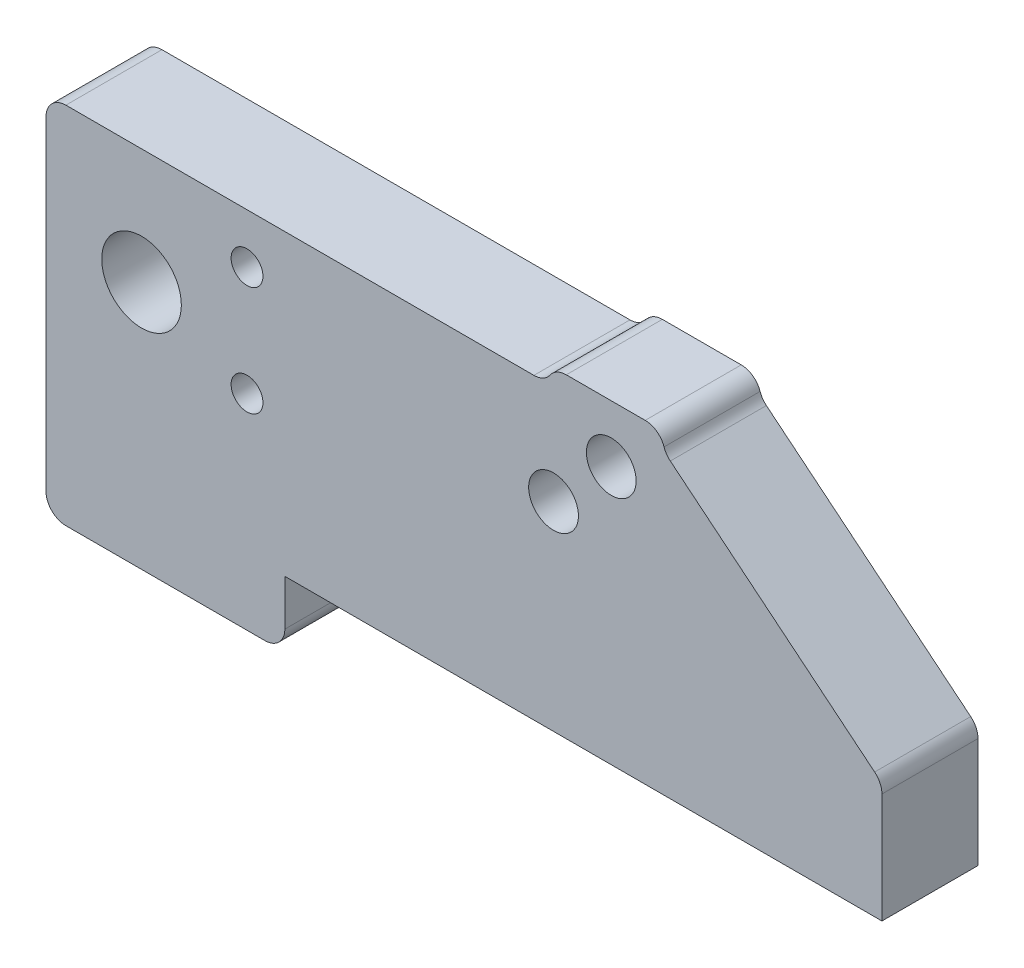
ISO-10303-21;
HEADER;
FILE_DESCRIPTION(('STEP AP214'),'2;1');
FILE_NAME('part.step','',(''),(''),'','','');
FILE_SCHEMA(('AUTOMOTIVE_DESIGN { 1 0 10303 214 1 1 1 1 }'));
ENDSEC;
DATA;
#1=APPLICATION_CONTEXT('core data for automotive mechanical design processes');
#2=APPLICATION_PROTOCOL_DEFINITION('international standard','automotive_design',2000,#1);
#3=PRODUCT_CONTEXT('',#1,'mechanical');
#4=PRODUCT('Part','Part','',(#3));
#5=PRODUCT_RELATED_PRODUCT_CATEGORY('part','',(#4));
#6=PRODUCT_DEFINITION_FORMATION('','',#4);
#7=PRODUCT_DEFINITION_CONTEXT('part definition',#1,'design');
#8=PRODUCT_DEFINITION('design','',#6,#7);
#9=PRODUCT_DEFINITION_SHAPE('','',#8);
#10=(LENGTH_UNIT() NAMED_UNIT(*) SI_UNIT(.MILLI.,.METRE.));
#11=(NAMED_UNIT(*) PLANE_ANGLE_UNIT() SI_UNIT($,.RADIAN.));
#12=(NAMED_UNIT(*) SI_UNIT($,.STERADIAN.) SOLID_ANGLE_UNIT());
#13=UNCERTAINTY_MEASURE_WITH_UNIT(LENGTH_MEASURE(1.E-05),#10,'distance_accuracy_value','');
#14=(GEOMETRIC_REPRESENTATION_CONTEXT(3) GLOBAL_UNCERTAINTY_ASSIGNED_CONTEXT((#13)) GLOBAL_UNIT_ASSIGNED_CONTEXT((#10,
#11,#12)) REPRESENTATION_CONTEXT('',''));
#15=CARTESIAN_POINT('',(0.,0.,0.));
#16=DIRECTION('',(0.,0.,1.));
#17=DIRECTION('',(1.,0.,0.));
#18=AXIS2_PLACEMENT_3D('',#15,#16,#17);
#19=CARTESIAN_POINT('',(0.,15.,4.826));
#20=DIRECTION('',(0.,-1.,0.));
#21=DIRECTION('',(1.,0.,0.));
#22=AXIS2_PLACEMENT_3D('',#19,#20,#21);
#23=PLANE('',#22);
#24=DIRECTION('',(-1.,0.,0.));
#25=VECTOR('',#24,1.);
#26=CARTESIAN_POINT('',(0.,15.,4.826));
#27=LINE('',#26,#25);
#28=CARTESIAN_POINT('',(-6.48667431040535,15.,4.826));
#29=VERTEX_POINT('',#28);
#30=CARTESIAN_POINT('',(-30.,15.,4.826));
#31=VERTEX_POINT('',#30);
#32=EDGE_CURVE('E171',#29,#31,#27,.T.);
#33=ORIENTED_EDGE('',*,*,#32,.F.);
#34=DIRECTION('',(0.,0.,-1.));
#35=VECTOR('',#34,1.);
#36=CARTESIAN_POINT('',(-6.48667431040535,15.,4.826));
#37=LINE('',#36,#35);
#38=CARTESIAN_POINT('',(-6.48667431040535,15.,0.));
#39=VERTEX_POINT('',#38);
#40=EDGE_CURVE('E248',#29,#39,#37,.T.);
#41=ORIENTED_EDGE('',*,*,#40,.T.);
#42=DIRECTION('',(-1.,0.,0.));
#43=VECTOR('',#42,1.);
#44=CARTESIAN_POINT('',(0.,15.,0.));
#45=LINE('',#44,#43);
#46=CARTESIAN_POINT('',(-30.,15.,0.));
#47=VERTEX_POINT('',#46);
#48=EDGE_CURVE('E224',#39,#47,#45,.T.);
#49=ORIENTED_EDGE('',*,*,#48,.T.);
#50=DIRECTION('',(0.,0.,-1.));
#51=VECTOR('',#50,1.);
#52=CARTESIAN_POINT('',(-30.,15.,4.826));
#53=LINE('',#52,#51);
#54=EDGE_CURVE('E246',#47,#31,#53,.F.);
#55=ORIENTED_EDGE('',*,*,#54,.T.);
#56=EDGE_LOOP('',(#33,#41,#49,#55));
#57=FACE_BOUND('',#56,.T.);
#58=ADVANCED_FACE('F37',(#57),#23,.F.);
#59=CARTESIAN_POINT('',(0.,0.,4.826));
#60=DIRECTION('',(0.,-1.,0.));
#61=DIRECTION('',(0.,0.,-1.));
#62=AXIS2_PLACEMENT_3D('',#59,#60,#61);
#63=PLANE('',#62);
#64=CARTESIAN_POINT('',(-4.,0.,2.413));
#65=DIRECTION('',(0.,-1.,0.));
#66=DIRECTION('',(0.,0.,-1.));
#67=AXIS2_PLACEMENT_3D('',#64,#65,#66);
#68=CIRCLE('',#67,1.24999999999999);
#69=CARTESIAN_POINT('',(-4.,0.,1.16300000000001));
#70=VERTEX_POINT('',#69);
#71=EDGE_CURVE('E206',#70,#70,#68,.T.);
#72=ORIENTED_EDGE('',*,*,#71,.F.);
#73=EDGE_LOOP('',(#72));
#74=FACE_BOUND('',#73,.T.);
#75=CARTESIAN_POINT('',(8.,0.,2.413));
#76=DIRECTION('',(0.,-1.,0.));
#77=DIRECTION('',(0.,0.,-1.));
#78=AXIS2_PLACEMENT_3D('',#75,#76,#77);
#79=CIRCLE('',#78,1.24999999999999);
#80=CARTESIAN_POINT('',(8.,0.,1.16300000000001));
#81=VERTEX_POINT('',#80);
#82=EDGE_CURVE('E212',#81,#81,#79,.T.);
#83=ORIENTED_EDGE('',*,*,#82,.F.);
#84=EDGE_LOOP('',(#83));
#85=FACE_BOUND('',#84,.T.);
#86=DIRECTION('',(-1.,0.,0.));
#87=VECTOR('',#86,1.);
#88=CARTESIAN_POINT('',(0.,0.,0.));
#89=LINE('',#88,#87);
#90=CARTESIAN_POINT('',(11.,0.,0.));
#91=VERTEX_POINT('',#90);
#92=CARTESIAN_POINT('',(-19.,0.,0.));
#93=VERTEX_POINT('',#92);
#94=EDGE_CURVE('E236',#91,#93,#89,.T.);
#95=ORIENTED_EDGE('',*,*,#94,.F.);
#96=DIRECTION('',(0.,0.,-1.));
#97=VECTOR('',#96,1.);
#98=CARTESIAN_POINT('',(11.,0.,4.826));
#99=LINE('',#98,#97);
#100=CARTESIAN_POINT('',(11.,0.,4.826));
#101=VERTEX_POINT('',#100);
#102=EDGE_CURVE('E167',#101,#91,#99,.T.);
#103=ORIENTED_EDGE('',*,*,#102,.F.);
#104=DIRECTION('',(-1.,0.,0.));
#105=VECTOR('',#104,1.);
#106=CARTESIAN_POINT('',(0.,0.,4.826));
#107=LINE('',#106,#105);
#108=CARTESIAN_POINT('',(-19.,0.,4.826));
#109=VERTEX_POINT('',#108);
#110=EDGE_CURVE('E160',#101,#109,#107,.T.);
#111=ORIENTED_EDGE('',*,*,#110,.T.);
#112=DIRECTION('',(0.,0.,-1.));
#113=VECTOR('',#112,1.);
#114=CARTESIAN_POINT('',(-19.,0.,31.93485464198));
#115=LINE('',#114,#113);
#116=EDGE_CURVE('E164',#109,#93,#115,.T.);
#117=ORIENTED_EDGE('',*,*,#116,.T.);
#118=EDGE_LOOP('',(#95,#103,#111,#117));
#119=FACE_BOUND('',#118,.T.);
#120=ADVANCED_FACE('F163',(#74,#85,#119),#63,.T.);
#121=CARTESIAN_POINT('',(11.,0.,4.826));
#122=DIRECTION('',(1.,0.,0.));
#123=DIRECTION('',(0.,1.,0.));
#124=AXIS2_PLACEMENT_3D('',#121,#122,#123);
#125=PLANE('',#124);
#126=DIRECTION('',(0.,-1.,0.));
#127=VECTOR('',#126,1.);
#128=CARTESIAN_POINT('',(11.,0.,0.));
#129=LINE('',#128,#127);
#130=CARTESIAN_POINT('',(11.,5.52612087240437,0.));
#131=VERTEX_POINT('',#130);
#132=EDGE_CURVE('E238',#131,#91,#129,.T.);
#133=ORIENTED_EDGE('',*,*,#132,.F.);
#134=DIRECTION('',(0.,0.,-1.));
#135=VECTOR('',#134,1.);
#136=CARTESIAN_POINT('',(11.,5.52612087240437,4.826));
#137=LINE('',#136,#135);
#138=CARTESIAN_POINT('',(11.,5.52612087240437,4.826));
#139=VERTEX_POINT('',#138);
#140=EDGE_CURVE('E264',#131,#139,#137,.F.);
#141=ORIENTED_EDGE('',*,*,#140,.T.);
#142=DIRECTION('',(0.,-1.,0.));
#143=VECTOR('',#142,1.);
#144=CARTESIAN_POINT('',(11.,0.,4.826));
#145=LINE('',#144,#143);
#146=EDGE_CURVE('E170',#139,#101,#145,.T.);
#147=ORIENTED_EDGE('',*,*,#146,.T.);
#148=ORIENTED_EDGE('',*,*,#102,.T.);
#149=EDGE_LOOP('',(#133,#141,#147,#148));
#150=FACE_BOUND('',#149,.T.);
#151=ADVANCED_FACE('F329',(#150),#125,.T.);
#152=CARTESIAN_POINT('',(7.35148514851485,8.98514851485148,4.826));
#153=DIRECTION('',(0.633237790257263,0.773957299203321,0.));
#154=DIRECTION('',(-0.773957299203321,0.633237790257263,0.));
#155=AXIS2_PLACEMENT_3D('',#152,#153,#154);
#156=PLANE('',#155);
#157=DIRECTION('',(0.773957299203321,-0.633237790257263,0.));
#158=VECTOR('',#157,1.);
#159=CARTESIAN_POINT('',(7.35148514851485,8.98514851485148,4.826));
#160=LINE('',#159,#158);
#161=CARTESIAN_POINT('',(0.366762209742737,14.6999218283923,4.826));
#162=VERTEX_POINT('',#161);
#163=CARTESIAN_POINT('',(10.6332377902573,6.3000781716077,4.826));
#164=VERTEX_POINT('',#163);
#165=EDGE_CURVE('E229',#162,#164,#160,.T.);
#166=ORIENTED_EDGE('',*,*,#165,.T.);
#167=DIRECTION('',(0.,0.,-1.));
#168=VECTOR('',#167,1.);
#169=CARTESIAN_POINT('',(10.6332377902573,6.3000781716077,4.826));
#170=LINE('',#169,#168);
#171=CARTESIAN_POINT('',(10.6332377902573,6.3000781716077,0.));
#172=VERTEX_POINT('',#171);
#173=EDGE_CURVE('E253',#164,#172,#170,.T.);
#174=ORIENTED_EDGE('',*,*,#173,.T.);
#175=DIRECTION('',(0.773957299203321,-0.633237790257263,0.));
#176=VECTOR('',#175,1.);
#177=CARTESIAN_POINT('',(7.35148514851485,8.98514851485148,0.));
#178=LINE('',#177,#176);
#179=CARTESIAN_POINT('',(0.366762209742737,14.6999218283923,0.));
#180=VERTEX_POINT('',#179);
#181=EDGE_CURVE('E240',#180,#172,#178,.T.);
#182=ORIENTED_EDGE('',*,*,#181,.F.);
#183=DIRECTION('',(0.,0.,-1.));
#184=VECTOR('',#183,1.);
#185=CARTESIAN_POINT('',(0.366762209742737,14.6999218283923,4.826));
#186=LINE('',#185,#184);
#187=EDGE_CURVE('E251',#180,#162,#186,.F.);
#188=ORIENTED_EDGE('',*,*,#187,.T.);
#189=EDGE_LOOP('',(#166,#174,#182,#188));
#190=FACE_BOUND('',#189,.T.);
#191=ADVANCED_FACE('F321',(#190),#156,.T.);
#192=CARTESIAN_POINT('',(0.,15.8372922706626,4.826));
#193=DIRECTION('',(0.,-1.,0.));
#194=DIRECTION('',(0.,0.,-1.));
#195=AXIS2_PLACEMENT_3D('',#192,#193,#194);
#196=PLANE('',#195);
#197=DIRECTION('',(-1.,0.,0.));
#198=VECTOR('',#197,1.);
#199=CARTESIAN_POINT('',(0.,15.8372922706626,4.826));
#200=LINE('',#199,#198);
#201=CARTESIAN_POINT('',(-0.895984486640166,15.8372922706626,4.826));
#202=VERTEX_POINT('',#201);
#203=CARTESIAN_POINT('',(-4.85937263703955,15.8372922706626,4.826));
#204=VERTEX_POINT('',#203);
#205=EDGE_CURVE('E232',#202,#204,#200,.T.);
#206=ORIENTED_EDGE('',*,*,#205,.F.);
#207=DIRECTION('',(0.,0.,-1.));
#208=VECTOR('',#207,1.);
#209=CARTESIAN_POINT('',(-0.895984486640166,15.8372922706626,4.826));
#210=LINE('',#209,#208);
#211=CARTESIAN_POINT('',(-0.895984486640166,15.8372922706626,0.));
#212=VERTEX_POINT('',#211);
#213=EDGE_CURVE('E296',#202,#212,#210,.T.);
#214=ORIENTED_EDGE('',*,*,#213,.T.);
#215=DIRECTION('',(-1.,0.,0.));
#216=VECTOR('',#215,1.);
#217=CARTESIAN_POINT('',(0.,15.8372922706626,0.));
#218=LINE('',#217,#216);
#219=CARTESIAN_POINT('',(-4.85937263703955,15.8372922706626,0.));
#220=VERTEX_POINT('',#219);
#221=EDGE_CURVE('E226',#212,#220,#218,.T.);
#222=ORIENTED_EDGE('',*,*,#221,.T.);
#223=DIRECTION('',(0.,0.,-1.));
#224=VECTOR('',#223,1.);
#225=CARTESIAN_POINT('',(-4.85937263703955,15.8372922706626,4.826));
#226=LINE('',#225,#224);
#227=EDGE_CURVE('E294',#220,#204,#226,.F.);
#228=ORIENTED_EDGE('',*,*,#227,.T.);
#229=EDGE_LOOP('',(#206,#214,#222,#228));
#230=FACE_BOUND('',#229,.T.);
#231=ADVANCED_FACE('F310',(#230),#196,.F.);
#232=CARTESIAN_POINT('',(0.,0.,4.826));
#233=DIRECTION('',(0.,0.,1.));
#234=DIRECTION('',(1.,0.,0.));
#235=AXIS2_PLACEMENT_3D('',#232,#233,#234);
#236=PLANE('',#235);
#237=CARTESIAN_POINT('',(-20.9,12.5,4.826));
#238=DIRECTION('',(0.,0.,1.));
#239=DIRECTION('',(1.,0.,0.));
#240=AXIS2_PLACEMENT_3D('',#237,#238,#239);
#241=CIRCLE('',#240,0.800000000000012);
#242=CARTESIAN_POINT('',(-20.1,12.5,4.826));
#243=VERTEX_POINT('',#242);
#244=EDGE_CURVE('E668',#243,#243,#241,.T.);
#245=ORIENTED_EDGE('',*,*,#244,.F.);
#246=EDGE_LOOP('',(#245));
#247=FACE_BOUND('',#246,.T.);
#248=CARTESIAN_POINT('',(-20.9,7.,4.826));
#249=DIRECTION('',(0.,0.,1.));
#250=DIRECTION('',(1.,0.,0.));
#251=AXIS2_PLACEMENT_3D('',#248,#249,#250);
#252=CIRCLE('',#251,0.800000000000012);
#253=CARTESIAN_POINT('',(-20.1,7.,4.826));
#254=VERTEX_POINT('',#253);
#255=EDGE_CURVE('E664',#254,#254,#252,.T.);
#256=ORIENTED_EDGE('',*,*,#255,.F.);
#257=EDGE_LOOP('',(#256));
#258=FACE_BOUND('',#257,.T.);
#259=CARTESIAN_POINT('',(-2.6,12.97,4.826));
#260=DIRECTION('',(0.,0.,-1.));
#261=DIRECTION('',(-1.,0.,0.));
#262=AXIS2_PLACEMENT_3D('',#259,#260,#261);
#263=CIRCLE('',#262,1.25);
#264=CARTESIAN_POINT('',(-3.85,12.97,4.826));
#265=VERTEX_POINT('',#264);
#266=EDGE_CURVE('E202',#265,#265,#263,.T.);
#267=ORIENTED_EDGE('',*,*,#266,.T.);
#268=EDGE_LOOP('',(#267));
#269=FACE_BOUND('',#268,.T.);
#270=CARTESIAN_POINT('',(-5.5,10.,4.826));
#271=DIRECTION('',(0.,0.,1.));
#272=DIRECTION('',(1.,0.,0.));
#273=AXIS2_PLACEMENT_3D('',#270,#271,#272);
#274=CIRCLE('',#273,1.25);
#275=CARTESIAN_POINT('',(-4.25,10.,4.826));
#276=VERTEX_POINT('',#275);
#277=EDGE_CURVE('E218',#276,#276,#274,.T.);
#278=ORIENTED_EDGE('',*,*,#277,.F.);
#279=EDGE_LOOP('',(#278));
#280=FACE_BOUND('',#279,.T.);
#281=CARTESIAN_POINT('',(1.,15.4738791275956,4.826));
#282=DIRECTION('',(0.,0.,1.));
#283=DIRECTION('',(1.,0.,0.));
#284=AXIS2_PLACEMENT_3D('',#281,#282,#283);
#285=CIRCLE('',#284,1.);
#286=CARTESIAN_POINT('',(0.0520077566799175,15.1555856991291,4.826));
#287=VERTEX_POINT('',#286);
#288=EDGE_CURVE('E292',#162,#287,#285,.F.);
#289=ORIENTED_EDGE('',*,*,#288,.T.);
#290=CARTESIAN_POINT('',(-0.895984486640166,14.8372922706626,4.826));
#291=DIRECTION('',(0.,0.,1.));
#292=DIRECTION('',(1.,0.,0.));
#293=AXIS2_PLACEMENT_3D('',#290,#291,#292);
#294=CIRCLE('',#293,1.);
#295=EDGE_CURVE('E45',#287,#202,#294,.T.);
#296=ORIENTED_EDGE('',*,*,#295,.T.);
#297=ORIENTED_EDGE('',*,*,#205,.T.);
#298=CARTESIAN_POINT('',(-4.85937263703955,14.8372922706626,4.826));
#299=DIRECTION('',(0.,0.,1.));
#300=DIRECTION('',(1.,0.,0.));
#301=AXIS2_PLACEMENT_3D('',#298,#299,#300);
#302=CIRCLE('',#301,1.);
#303=CARTESIAN_POINT('',(-5.67302347372245,15.4186461353313,4.826));
#304=VERTEX_POINT('',#303);
#305=EDGE_CURVE('E52',#204,#304,#302,.T.);
#306=ORIENTED_EDGE('',*,*,#305,.T.);
#307=CARTESIAN_POINT('',(-6.48667431040535,16.,4.826));
#308=DIRECTION('',(0.,0.,1.));
#309=DIRECTION('',(1.,0.,0.));
#310=AXIS2_PLACEMENT_3D('',#307,#308,#309);
#311=CIRCLE('',#310,1.);
#312=EDGE_CURVE('E288',#304,#29,#311,.F.);
#313=ORIENTED_EDGE('',*,*,#312,.T.);
#314=ORIENTED_EDGE('',*,*,#32,.T.);
#315=CARTESIAN_POINT('',(-30.,14.,4.826));
#316=DIRECTION('',(0.,0.,1.));
#317=DIRECTION('',(1.,0.,0.));
#318=AXIS2_PLACEMENT_3D('',#315,#316,#317);
#319=CIRCLE('',#318,1.);
#320=CARTESIAN_POINT('',(-31.,14.,4.826));
#321=VERTEX_POINT('',#320);
#322=EDGE_CURVE('E269',#31,#321,#319,.T.);
#323=ORIENTED_EDGE('',*,*,#322,.T.);
#324=DIRECTION('',(0.,1.,0.));
#325=VECTOR('',#324,1.);
#326=CARTESIAN_POINT('',(-31.,0.,4.826));
#327=LINE('',#326,#325);
#328=CARTESIAN_POINT('',(-31.,-2.3,4.826));
#329=VERTEX_POINT('',#328);
#330=EDGE_CURVE('E191',#329,#321,#327,.T.);
#331=ORIENTED_EDGE('',*,*,#330,.F.);
#332=CARTESIAN_POINT('',(-30.,-2.3,4.826));
#333=DIRECTION('',(0.,0.,1.));
#334=DIRECTION('',(1.,0.,0.));
#335=AXIS2_PLACEMENT_3D('',#332,#333,#334);
#336=CIRCLE('',#335,1.);
#337=CARTESIAN_POINT('',(-30.,-3.3,4.826));
#338=VERTEX_POINT('',#337);
#339=EDGE_CURVE('E266',#329,#338,#336,.T.);
#340=ORIENTED_EDGE('',*,*,#339,.T.);
#341=DIRECTION('',(-1.,0.,0.));
#342=VECTOR('',#341,1.);
#343=CARTESIAN_POINT('',(0.,-3.3,4.826));
#344=LINE('',#343,#342);
#345=CARTESIAN_POINT('',(-20.,-3.3,4.826));
#346=VERTEX_POINT('',#345);
#347=EDGE_CURVE('E188',#346,#338,#344,.T.);
#348=ORIENTED_EDGE('',*,*,#347,.F.);
#349=CARTESIAN_POINT('',(-20.,-2.3,4.826));
#350=DIRECTION('',(0.,0.,1.));
#351=DIRECTION('',(1.,0.,0.));
#352=AXIS2_PLACEMENT_3D('',#349,#350,#351);
#353=CIRCLE('',#352,1.);
#354=CARTESIAN_POINT('',(-19.,-2.3,4.826));
#355=VERTEX_POINT('',#354);
#356=EDGE_CURVE('E187',#346,#355,#353,.T.);
#357=ORIENTED_EDGE('',*,*,#356,.T.);
#358=DIRECTION('',(0.,-1.,0.));
#359=VECTOR('',#358,1.);
#360=CARTESIAN_POINT('',(-19.,0.,4.826));
#361=LINE('',#360,#359);
#362=EDGE_CURVE('E177',#109,#355,#361,.T.);
#363=ORIENTED_EDGE('',*,*,#362,.F.);
#364=ORIENTED_EDGE('',*,*,#110,.F.);
#365=ORIENTED_EDGE('',*,*,#146,.F.);
#366=CARTESIAN_POINT('',(10.,5.52612087240437,4.826));
#367=DIRECTION('',(0.,0.,1.));
#368=DIRECTION('',(1.,0.,0.));
#369=AXIS2_PLACEMENT_3D('',#366,#367,#368);
#370=CIRCLE('',#369,1.);
#371=EDGE_CURVE('E271',#139,#164,#370,.T.);
#372=ORIENTED_EDGE('',*,*,#371,.T.);
#373=ORIENTED_EDGE('',*,*,#165,.F.);
#374=EDGE_LOOP('',(#289,#296,#297,#306,#313,#314,#323,#331,#340,#348,#357,#363,#364,#365,#372,#373));
#375=FACE_BOUND('',#374,.T.);
#376=CARTESIAN_POINT('',(-26.2,9.2,4.826));
#377=DIRECTION('',(0.,0.,1.));
#378=DIRECTION('',(1.,0.,0.));
#379=AXIS2_PLACEMENT_3D('',#376,#377,#378);
#380=CIRCLE('',#379,2.);
#381=CARTESIAN_POINT('',(-24.2,9.2,4.826));
#382=VERTEX_POINT('',#381);
#383=EDGE_CURVE('E181',#382,#382,#380,.T.);
#384=ORIENTED_EDGE('',*,*,#383,.F.);
#385=EDGE_LOOP('',(#384));
#386=FACE_BOUND('',#385,.T.);
#387=ADVANCED_FACE('F183',(#247,#258,#269,#280,#375,#386),#236,.T.);
#388=CARTESIAN_POINT('',(0.,0.,0.));
#389=DIRECTION('',(0.,0.,1.));
#390=DIRECTION('',(1.,0.,0.));
#391=AXIS2_PLACEMENT_3D('',#388,#389,#390);
#392=PLANE('',#391);
#393=CARTESIAN_POINT('',(-20.9,12.5,0.));
#394=DIRECTION('',(0.,0.,1.));
#395=DIRECTION('',(1.,0.,0.));
#396=AXIS2_PLACEMENT_3D('',#393,#394,#395);
#397=CIRCLE('',#396,0.800000000000012);
#398=CARTESIAN_POINT('',(-20.1,12.5,0.));
#399=VERTEX_POINT('',#398);
#400=EDGE_CURVE('E661',#399,#399,#397,.T.);
#401=ORIENTED_EDGE('',*,*,#400,.T.);
#402=EDGE_LOOP('',(#401));
#403=FACE_BOUND('',#402,.T.);
#404=CARTESIAN_POINT('',(-20.9,7.,0.));
#405=DIRECTION('',(0.,0.,1.));
#406=DIRECTION('',(1.,0.,0.));
#407=AXIS2_PLACEMENT_3D('',#404,#405,#406);
#408=CIRCLE('',#407,0.800000000000012);
#409=CARTESIAN_POINT('',(-20.1,7.,0.));
#410=VERTEX_POINT('',#409);
#411=EDGE_CURVE('E197',#410,#410,#408,.T.);
#412=ORIENTED_EDGE('',*,*,#411,.T.);
#413=EDGE_LOOP('',(#412));
#414=FACE_BOUND('',#413,.T.);
#415=CARTESIAN_POINT('',(-2.6,12.97,0.));
#416=DIRECTION('',(0.,0.,-1.));
#417=DIRECTION('',(-1.,0.,0.));
#418=AXIS2_PLACEMENT_3D('',#415,#416,#417);
#419=CIRCLE('',#418,1.24999999999999);
#420=CARTESIAN_POINT('',(-3.84999999999999,12.97,0.));
#421=VERTEX_POINT('',#420);
#422=EDGE_CURVE('E199',#421,#421,#419,.T.);
#423=ORIENTED_EDGE('',*,*,#422,.F.);
#424=EDGE_LOOP('',(#423));
#425=FACE_BOUND('',#424,.T.);
#426=CARTESIAN_POINT('',(-5.5,10.,0.));
#427=DIRECTION('',(0.,0.,1.));
#428=DIRECTION('',(1.,0.,0.));
#429=AXIS2_PLACEMENT_3D('',#426,#427,#428);
#430=CIRCLE('',#429,1.25);
#431=CARTESIAN_POINT('',(-4.25,10.,0.));
#432=VERTEX_POINT('',#431);
#433=EDGE_CURVE('E221',#432,#432,#430,.T.);
#434=ORIENTED_EDGE('',*,*,#433,.T.);
#435=EDGE_LOOP('',(#434));
#436=FACE_BOUND('',#435,.T.);
#437=ORIENTED_EDGE('',*,*,#221,.F.);
#438=CARTESIAN_POINT('',(-0.895984486640166,14.8372922706626,0.));
#439=DIRECTION('',(0.,0.,1.));
#440=DIRECTION('',(1.,0.,0.));
#441=AXIS2_PLACEMENT_3D('',#438,#439,#440);
#442=CIRCLE('',#441,1.);
#443=CARTESIAN_POINT('',(0.0520077566799175,15.1555856991291,0.));
#444=VERTEX_POINT('',#443);
#445=EDGE_CURVE('E301',#212,#444,#442,.F.);
#446=ORIENTED_EDGE('',*,*,#445,.T.);
#447=CARTESIAN_POINT('',(1.,15.4738791275956,0.));
#448=DIRECTION('',(0.,0.,1.));
#449=DIRECTION('',(1.,0.,0.));
#450=AXIS2_PLACEMENT_3D('',#447,#448,#449);
#451=CIRCLE('',#450,1.);
#452=EDGE_CURVE('E290',#444,#180,#451,.T.);
#453=ORIENTED_EDGE('',*,*,#452,.T.);
#454=ORIENTED_EDGE('',*,*,#181,.T.);
#455=CARTESIAN_POINT('',(10.,5.52612087240437,0.));
#456=DIRECTION('',(0.,0.,1.));
#457=DIRECTION('',(1.,0.,0.));
#458=AXIS2_PLACEMENT_3D('',#455,#456,#457);
#459=CIRCLE('',#458,1.);
#460=EDGE_CURVE('E262',#172,#131,#459,.F.);
#461=ORIENTED_EDGE('',*,*,#460,.T.);
#462=ORIENTED_EDGE('',*,*,#132,.T.);
#463=ORIENTED_EDGE('',*,*,#94,.T.);
#464=DIRECTION('',(0.,-1.,0.));
#465=VECTOR('',#464,1.);
#466=CARTESIAN_POINT('',(-19.,0.,0.));
#467=LINE('',#466,#465);
#468=CARTESIAN_POINT('',(-19.,-2.3,0.));
#469=VERTEX_POINT('',#468);
#470=EDGE_CURVE('E180',#93,#469,#467,.T.);
#471=ORIENTED_EDGE('',*,*,#470,.T.);
#472=CARTESIAN_POINT('',(-20.,-2.3,0.));
#473=DIRECTION('',(0.,0.,1.));
#474=DIRECTION('',(1.,0.,0.));
#475=AXIS2_PLACEMENT_3D('',#472,#473,#474);
#476=CIRCLE('',#475,1.);
#477=CARTESIAN_POINT('',(-20.,-3.3,0.));
#478=VERTEX_POINT('',#477);
#479=EDGE_CURVE('E258',#469,#478,#476,.F.);
#480=ORIENTED_EDGE('',*,*,#479,.T.);
#481=DIRECTION('',(-1.,0.,0.));
#482=VECTOR('',#481,1.);
#483=CARTESIAN_POINT('',(0.,-3.3,0.));
#484=LINE('',#483,#482);
#485=CARTESIAN_POINT('',(-30.,-3.3,0.));
#486=VERTEX_POINT('',#485);
#487=EDGE_CURVE('E332',#478,#486,#484,.T.);
#488=ORIENTED_EDGE('',*,*,#487,.T.);
#489=CARTESIAN_POINT('',(-30.,-2.3,0.));
#490=DIRECTION('',(0.,0.,1.));
#491=DIRECTION('',(1.,0.,0.));
#492=AXIS2_PLACEMENT_3D('',#489,#490,#491);
#493=CIRCLE('',#492,1.);
#494=CARTESIAN_POINT('',(-31.,-2.3,0.));
#495=VERTEX_POINT('',#494);
#496=EDGE_CURVE('E256',#486,#495,#493,.F.);
#497=ORIENTED_EDGE('',*,*,#496,.T.);
#498=DIRECTION('',(0.,1.,0.));
#499=VECTOR('',#498,1.);
#500=CARTESIAN_POINT('',(-31.,0.,0.));
#501=LINE('',#500,#499);
#502=CARTESIAN_POINT('',(-31.,14.,0.));
#503=VERTEX_POINT('',#502);
#504=EDGE_CURVE('E203',#495,#503,#501,.T.);
#505=ORIENTED_EDGE('',*,*,#504,.T.);
#506=CARTESIAN_POINT('',(-30.,14.,0.));
#507=DIRECTION('',(0.,0.,1.));
#508=DIRECTION('',(1.,0.,0.));
#509=AXIS2_PLACEMENT_3D('',#506,#507,#508);
#510=CIRCLE('',#509,1.);
#511=EDGE_CURVE('E260',#503,#47,#510,.F.);
#512=ORIENTED_EDGE('',*,*,#511,.T.);
#513=ORIENTED_EDGE('',*,*,#48,.F.);
#514=CARTESIAN_POINT('',(-6.48667431040535,16.,0.));
#515=DIRECTION('',(0.,0.,1.));
#516=DIRECTION('',(1.,0.,0.));
#517=AXIS2_PLACEMENT_3D('',#514,#515,#516);
#518=CIRCLE('',#517,1.);
#519=CARTESIAN_POINT('',(-5.67302347372245,15.4186461353313,0.));
#520=VERTEX_POINT('',#519);
#521=EDGE_CURVE('E285',#39,#520,#518,.T.);
#522=ORIENTED_EDGE('',*,*,#521,.T.);
#523=CARTESIAN_POINT('',(-4.85937263703955,14.8372922706626,0.));
#524=DIRECTION('',(0.,0.,1.));
#525=DIRECTION('',(1.,0.,0.));
#526=AXIS2_PLACEMENT_3D('',#523,#524,#525);
#527=CIRCLE('',#526,1.);
#528=EDGE_CURVE('E299',#520,#220,#527,.F.);
#529=ORIENTED_EDGE('',*,*,#528,.T.);
#530=EDGE_LOOP('',(#437,#446,#453,#454,#461,#462,#463,#471,#480,#488,#497,#505,#512,#513,#522,#529));
#531=FACE_BOUND('',#530,.T.);
#532=CARTESIAN_POINT('',(-26.2,9.2,0.));
#533=DIRECTION('',(0.,0.,1.));
#534=DIRECTION('',(1.,0.,0.));
#535=AXIS2_PLACEMENT_3D('',#532,#533,#534);
#536=CIRCLE('',#535,2.);
#537=CARTESIAN_POINT('',(-24.2,9.2,0.));
#538=VERTEX_POINT('',#537);
#539=EDGE_CURVE('E333',#538,#538,#536,.T.);
#540=ORIENTED_EDGE('',*,*,#539,.T.);
#541=EDGE_LOOP('',(#540));
#542=FACE_BOUND('',#541,.T.);
#543=ADVANCED_FACE('F315',(#403,#414,#425,#436,#531,#542),#392,.F.);
#544=CARTESIAN_POINT('',(-5.5,10.,4.826));
#545=DIRECTION('',(0.,0.,1.));
#546=DIRECTION('',(1.,0.,0.));
#547=AXIS2_PLACEMENT_3D('',#544,#545,#546);
#548=CYLINDRICAL_SURFACE('',#547,1.25);
#549=ORIENTED_EDGE('',*,*,#433,.F.);
#550=EDGE_LOOP('',(#549));
#551=FACE_BOUND('',#550,.T.);
#552=ORIENTED_EDGE('',*,*,#277,.T.);
#553=EDGE_LOOP('',(#552));
#554=FACE_BOUND('',#553,.T.);
#555=ADVANCED_FACE('F457',(#551,#554),#548,.F.);
#556=CARTESIAN_POINT('',(8.,5.,2.413));
#557=DIRECTION('',(0.,-1.,0.));
#558=DIRECTION('',(0.,0.,-1.));
#559=AXIS2_PLACEMENT_3D('',#556,#557,#558);
#560=CONICAL_SURFACE('',#559,1.25,1.02974425867665);
#561=CARTESIAN_POINT('',(8.,5.75107577378445,2.413));
#562=VERTEX_POINT('',#561);
#563=VERTEX_LOOP('',#562);
#564=FACE_BOUND('',#563,.T.);
#565=CARTESIAN_POINT('',(8.,5.,2.413));
#566=DIRECTION('',(0.,-1.,0.));
#567=DIRECTION('',(0.,0.,-1.));
#568=AXIS2_PLACEMENT_3D('',#565,#566,#567);
#569=CIRCLE('',#568,1.25);
#570=CARTESIAN_POINT('',(8.,5.,1.163));
#571=VERTEX_POINT('',#570);
#572=EDGE_CURVE('E215',#571,#571,#569,.T.);
#573=ORIENTED_EDGE('',*,*,#572,.T.);
#574=EDGE_LOOP('',(#573));
#575=FACE_BOUND('',#574,.T.);
#576=ADVANCED_FACE('F588',(#564,#575),#560,.F.);
#577=CARTESIAN_POINT('',(8.,0.,2.413));
#578=DIRECTION('',(0.,-1.,0.));
#579=DIRECTION('',(0.,0.,-1.));
#580=AXIS2_PLACEMENT_3D('',#577,#578,#579);
#581=CYLINDRICAL_SURFACE('',#580,1.24999999999999);
#582=ORIENTED_EDGE('',*,*,#572,.F.);
#583=EDGE_LOOP('',(#582));
#584=FACE_BOUND('',#583,.T.);
#585=ORIENTED_EDGE('',*,*,#82,.T.);
#586=EDGE_LOOP('',(#585));
#587=FACE_BOUND('',#586,.T.);
#588=ADVANCED_FACE('F578',(#584,#587),#581,.F.);
#589=CARTESIAN_POINT('',(-4.,5.,2.413));
#590=DIRECTION('',(0.,-1.,0.));
#591=DIRECTION('',(0.,0.,-1.));
#592=AXIS2_PLACEMENT_3D('',#589,#590,#591);
#593=CONICAL_SURFACE('',#592,1.25,1.02974425867665);
#594=CARTESIAN_POINT('',(-4.,5.75107577378445,2.413));
#595=VERTEX_POINT('',#594);
#596=VERTEX_LOOP('',#595);
#597=FACE_BOUND('',#596,.T.);
#598=CARTESIAN_POINT('',(-4.,5.,2.413));
#599=DIRECTION('',(0.,-1.,0.));
#600=DIRECTION('',(0.,0.,-1.));
#601=AXIS2_PLACEMENT_3D('',#598,#599,#600);
#602=CIRCLE('',#601,1.25);
#603=CARTESIAN_POINT('',(-4.,5.,1.163));
#604=VERTEX_POINT('',#603);
#605=EDGE_CURVE('E209',#604,#604,#602,.T.);
#606=ORIENTED_EDGE('',*,*,#605,.T.);
#607=EDGE_LOOP('',(#606));
#608=FACE_BOUND('',#607,.T.);
#609=ADVANCED_FACE('F568',(#597,#608),#593,.F.);
#610=CARTESIAN_POINT('',(-4.,0.,2.413));
#611=DIRECTION('',(0.,-1.,0.));
#612=DIRECTION('',(0.,0.,-1.));
#613=AXIS2_PLACEMENT_3D('',#610,#611,#612);
#614=CYLINDRICAL_SURFACE('',#613,1.24999999999999);
#615=ORIENTED_EDGE('',*,*,#605,.F.);
#616=EDGE_LOOP('',(#615));
#617=FACE_BOUND('',#616,.T.);
#618=ORIENTED_EDGE('',*,*,#71,.T.);
#619=EDGE_LOOP('',(#618));
#620=FACE_BOUND('',#619,.T.);
#621=ADVANCED_FACE('F558',(#617,#620),#614,.F.);
#622=CARTESIAN_POINT('',(-2.6,12.97,0.));
#623=DIRECTION('',(0.,0.,-1.));
#624=DIRECTION('',(-1.,0.,0.));
#625=AXIS2_PLACEMENT_3D('',#622,#623,#624);
#626=CYLINDRICAL_SURFACE('',#625,1.24999999999999);
#627=ORIENTED_EDGE('',*,*,#266,.F.);
#628=EDGE_LOOP('',(#627));
#629=FACE_BOUND('',#628,.T.);
#630=ORIENTED_EDGE('',*,*,#422,.T.);
#631=EDGE_LOOP('',(#630));
#632=FACE_BOUND('',#631,.T.);
#633=ADVANCED_FACE('F520',(#629,#632),#626,.F.);
#634=CARTESIAN_POINT('',(-31.,0.,31.93485464198));
#635=DIRECTION('',(-1.,0.,0.));
#636=DIRECTION('',(0.,-1.,0.));
#637=AXIS2_PLACEMENT_3D('',#634,#635,#636);
#638=PLANE('',#637);
#639=ORIENTED_EDGE('',*,*,#330,.T.);
#640=DIRECTION('',(0.,0.,-1.));
#641=VECTOR('',#640,1.);
#642=CARTESIAN_POINT('',(-31.,14.,0.));
#643=LINE('',#642,#641);
#644=EDGE_CURVE('E275',#321,#503,#643,.T.);
#645=ORIENTED_EDGE('',*,*,#644,.T.);
#646=ORIENTED_EDGE('',*,*,#504,.F.);
#647=DIRECTION('',(0.,0.,-1.));
#648=VECTOR('',#647,1.);
#649=CARTESIAN_POINT('',(-31.,-2.3,31.93485464198));
#650=LINE('',#649,#648);
#651=EDGE_CURVE('E273',#495,#329,#650,.F.);
#652=ORIENTED_EDGE('',*,*,#651,.T.);
#653=EDGE_LOOP('',(#639,#645,#646,#652));
#654=FACE_BOUND('',#653,.T.);
#655=ADVANCED_FACE('F345',(#654),#638,.T.);
#656=CARTESIAN_POINT('',(0.,-3.3,31.93485464198));
#657=DIRECTION('',(0.,-1.,0.));
#658=DIRECTION('',(1.,0.,0.));
#659=AXIS2_PLACEMENT_3D('',#656,#657,#658);
#660=PLANE('',#659);
#661=ORIENTED_EDGE('',*,*,#487,.F.);
#662=DIRECTION('',(0.,0.,-1.));
#663=VECTOR('',#662,1.);
#664=CARTESIAN_POINT('',(-20.,-3.3,31.93485464198));
#665=LINE('',#664,#663);
#666=EDGE_CURVE('E283',#478,#346,#665,.F.);
#667=ORIENTED_EDGE('',*,*,#666,.T.);
#668=ORIENTED_EDGE('',*,*,#347,.T.);
#669=DIRECTION('',(0.,0.,-1.));
#670=VECTOR('',#669,1.);
#671=CARTESIAN_POINT('',(-30.,-3.3,31.93485464198));
#672=LINE('',#671,#670);
#673=EDGE_CURVE('E280',#338,#486,#672,.T.);
#674=ORIENTED_EDGE('',*,*,#673,.T.);
#675=EDGE_LOOP('',(#661,#667,#668,#674));
#676=FACE_BOUND('',#675,.T.);
#677=ADVANCED_FACE('F353',(#676),#660,.T.);
#678=CARTESIAN_POINT('',(-19.,0.,31.93485464198));
#679=DIRECTION('',(1.,0.,0.));
#680=DIRECTION('',(0.,1.,0.));
#681=AXIS2_PLACEMENT_3D('',#678,#679,#680);
#682=PLANE('',#681);
#683=ORIENTED_EDGE('',*,*,#362,.T.);
#684=DIRECTION('',(0.,0.,-1.));
#685=VECTOR('',#684,1.);
#686=CARTESIAN_POINT('',(-19.,-2.3,31.93485464198));
#687=LINE('',#686,#685);
#688=EDGE_CURVE('E278',#355,#469,#687,.T.);
#689=ORIENTED_EDGE('',*,*,#688,.T.);
#690=ORIENTED_EDGE('',*,*,#470,.F.);
#691=ORIENTED_EDGE('',*,*,#116,.F.);
#692=EDGE_LOOP('',(#683,#689,#690,#691));
#693=FACE_BOUND('',#692,.T.);
#694=ADVANCED_FACE('F175',(#693),#682,.T.);
#695=CARTESIAN_POINT('',(-26.2,9.2,31.93485464198));
#696=DIRECTION('',(0.,0.,-1.));
#697=DIRECTION('',(-1.,0.,0.));
#698=AXIS2_PLACEMENT_3D('',#695,#696,#697);
#699=CYLINDRICAL_SURFACE('',#698,2.);
#700=ORIENTED_EDGE('',*,*,#539,.F.);
#701=EDGE_LOOP('',(#700));
#702=FACE_BOUND('',#701,.T.);
#703=ORIENTED_EDGE('',*,*,#383,.T.);
#704=EDGE_LOOP('',(#703));
#705=FACE_BOUND('',#704,.T.);
#706=ADVANCED_FACE('F381',(#702,#705),#699,.F.);
#707=CARTESIAN_POINT('',(-6.48667431040535,16.,4.826));
#708=DIRECTION('',(0.,0.,-1.));
#709=DIRECTION('',(-1.,0.,0.));
#710=AXIS2_PLACEMENT_3D('',#707,#708,#709);
#711=CYLINDRICAL_SURFACE('',#710,1.);
#712=ORIENTED_EDGE('',*,*,#312,.F.);
#713=DIRECTION('',(0.,0.,-1.));
#714=VECTOR('',#713,1.);
#715=CARTESIAN_POINT('',(-5.67302347372245,15.4186461353313,4.826));
#716=LINE('',#715,#714);
#717=EDGE_CURVE('E11',#304,#520,#716,.T.);
#718=ORIENTED_EDGE('',*,*,#717,.T.);
#719=ORIENTED_EDGE('',*,*,#521,.F.);
#720=ORIENTED_EDGE('',*,*,#40,.F.);
#721=EDGE_LOOP('',(#712,#718,#719,#720));
#722=FACE_BOUND('',#721,.T.);
#723=ADVANCED_FACE('F378',(#722),#711,.F.);
#724=CARTESIAN_POINT('',(10.,5.52612087240437,4.826));
#725=DIRECTION('',(0.,0.,-1.));
#726=DIRECTION('',(-1.,0.,0.));
#727=AXIS2_PLACEMENT_3D('',#724,#725,#726);
#728=CYLINDRICAL_SURFACE('',#727,1.);
#729=ORIENTED_EDGE('',*,*,#371,.F.);
#730=ORIENTED_EDGE('',*,*,#140,.F.);
#731=ORIENTED_EDGE('',*,*,#460,.F.);
#732=ORIENTED_EDGE('',*,*,#173,.F.);
#733=EDGE_LOOP('',(#729,#730,#731,#732));
#734=FACE_BOUND('',#733,.T.);
#735=ADVANCED_FACE('F326',(#734),#728,.T.);
#736=CARTESIAN_POINT('',(-30.,14.,31.93485464198));
#737=DIRECTION('',(0.,0.,1.));
#738=DIRECTION('',(1.,0.,0.));
#739=AXIS2_PLACEMENT_3D('',#736,#737,#738);
#740=CYLINDRICAL_SURFACE('',#739,1.);
#741=ORIENTED_EDGE('',*,*,#322,.F.);
#742=ORIENTED_EDGE('',*,*,#54,.F.);
#743=ORIENTED_EDGE('',*,*,#511,.F.);
#744=ORIENTED_EDGE('',*,*,#644,.F.);
#745=EDGE_LOOP('',(#741,#742,#743,#744));
#746=FACE_BOUND('',#745,.T.);
#747=ADVANCED_FACE('F358',(#746),#740,.T.);
#748=CARTESIAN_POINT('',(-20.,-2.3,31.93485464198));
#749=DIRECTION('',(0.,0.,-1.));
#750=DIRECTION('',(-1.,0.,0.));
#751=AXIS2_PLACEMENT_3D('',#748,#749,#750);
#752=CYLINDRICAL_SURFACE('',#751,1.);
#753=ORIENTED_EDGE('',*,*,#356,.F.);
#754=ORIENTED_EDGE('',*,*,#666,.F.);
#755=ORIENTED_EDGE('',*,*,#479,.F.);
#756=ORIENTED_EDGE('',*,*,#688,.F.);
#757=EDGE_LOOP('',(#753,#754,#755,#756));
#758=FACE_BOUND('',#757,.T.);
#759=ADVANCED_FACE('F356',(#758),#752,.T.);
#760=CARTESIAN_POINT('',(-30.,-2.3,31.93485464198));
#761=DIRECTION('',(0.,0.,-1.));
#762=DIRECTION('',(-1.,0.,0.));
#763=AXIS2_PLACEMENT_3D('',#760,#761,#762);
#764=CYLINDRICAL_SURFACE('',#763,1.);
#765=ORIENTED_EDGE('',*,*,#339,.F.);
#766=ORIENTED_EDGE('',*,*,#651,.F.);
#767=ORIENTED_EDGE('',*,*,#496,.F.);
#768=ORIENTED_EDGE('',*,*,#673,.F.);
#769=EDGE_LOOP('',(#765,#766,#767,#768));
#770=FACE_BOUND('',#769,.T.);
#771=ADVANCED_FACE('F350',(#770),#764,.T.);
#772=CARTESIAN_POINT('',(1.,15.4738791275956,4.826));
#773=DIRECTION('',(0.,0.,-1.));
#774=DIRECTION('',(-1.,0.,0.));
#775=AXIS2_PLACEMENT_3D('',#772,#773,#774);
#776=CYLINDRICAL_SURFACE('',#775,1.);
#777=ORIENTED_EDGE('',*,*,#452,.F.);
#778=DIRECTION('',(0.,0.,-1.));
#779=VECTOR('',#778,1.);
#780=CARTESIAN_POINT('',(0.0520077566799174,15.1555856991291,4.826));
#781=LINE('',#780,#779);
#782=EDGE_CURVE('E60',#444,#287,#781,.F.);
#783=ORIENTED_EDGE('',*,*,#782,.T.);
#784=ORIENTED_EDGE('',*,*,#288,.F.);
#785=ORIENTED_EDGE('',*,*,#187,.F.);
#786=EDGE_LOOP('',(#777,#783,#784,#785));
#787=FACE_BOUND('',#786,.T.);
#788=ADVANCED_FACE('F319',(#787),#776,.F.);
#789=CARTESIAN_POINT('',(-20.9,7.,4.826));
#790=DIRECTION('',(0.,0.,1.));
#791=DIRECTION('',(1.,0.,0.));
#792=AXIS2_PLACEMENT_3D('',#789,#790,#791);
#793=CYLINDRICAL_SURFACE('',#792,0.800000000000012);
#794=ORIENTED_EDGE('',*,*,#411,.F.);
#795=EDGE_LOOP('',(#794));
#796=FACE_BOUND('',#795,.T.);
#797=ORIENTED_EDGE('',*,*,#255,.T.);
#798=EDGE_LOOP('',(#797));
#799=FACE_BOUND('',#798,.T.);
#800=ADVANCED_FACE('F411',(#796,#799),#793,.F.);
#801=CARTESIAN_POINT('',(-20.9,12.5,4.826));
#802=DIRECTION('',(0.,0.,1.));
#803=DIRECTION('',(1.,0.,0.));
#804=AXIS2_PLACEMENT_3D('',#801,#802,#803);
#805=CYLINDRICAL_SURFACE('',#804,0.800000000000012);
#806=ORIENTED_EDGE('',*,*,#400,.F.);
#807=EDGE_LOOP('',(#806));
#808=FACE_BOUND('',#807,.T.);
#809=ORIENTED_EDGE('',*,*,#244,.T.);
#810=EDGE_LOOP('',(#809));
#811=FACE_BOUND('',#810,.T.);
#812=ADVANCED_FACE('F416',(#808,#811),#805,.F.);
#813=CARTESIAN_POINT('',(-0.895984486640166,14.8372922706626,4.826));
#814=DIRECTION('',(0.,0.,-1.));
#815=DIRECTION('',(-1.,0.,0.));
#816=AXIS2_PLACEMENT_3D('',#813,#814,#815);
#817=CYLINDRICAL_SURFACE('',#816,1.);
#818=ORIENTED_EDGE('',*,*,#295,.F.);
#819=ORIENTED_EDGE('',*,*,#782,.F.);
#820=ORIENTED_EDGE('',*,*,#445,.F.);
#821=ORIENTED_EDGE('',*,*,#213,.F.);
#822=EDGE_LOOP('',(#818,#819,#820,#821));
#823=FACE_BOUND('',#822,.T.);
#824=ADVANCED_FACE('F313',(#823),#817,.T.);
#825=CARTESIAN_POINT('',(-4.85937263703955,14.8372922706626,4.826));
#826=DIRECTION('',(0.,0.,-1.));
#827=DIRECTION('',(-1.,0.,0.));
#828=AXIS2_PLACEMENT_3D('',#825,#826,#827);
#829=CYLINDRICAL_SURFACE('',#828,1.);
#830=ORIENTED_EDGE('',*,*,#305,.F.);
#831=ORIENTED_EDGE('',*,*,#227,.F.);
#832=ORIENTED_EDGE('',*,*,#528,.F.);
#833=ORIENTED_EDGE('',*,*,#717,.F.);
#834=EDGE_LOOP('',(#830,#831,#832,#833));
#835=FACE_BOUND('',#834,.T.);
#836=ADVANCED_FACE('F39',(#835),#829,.T.);
#837=CLOSED_SHELL('',(#58,#120,#151,#191,#231,#387,#543,#555,#576,#588,#609,#621,#633,#655,#677,
#694,#706,#723,#735,#747,#759,#771,#788,#800,#812,#824,#836));
#838=MANIFOLD_SOLID_BREP('B2',#837);
#839=ADVANCED_BREP_SHAPE_REPRESENTATION('',(#18,#838),#14);
#840=SHAPE_DEFINITION_REPRESENTATION(#9,#839);
ENDSEC;
END-ISO-10303-21;
